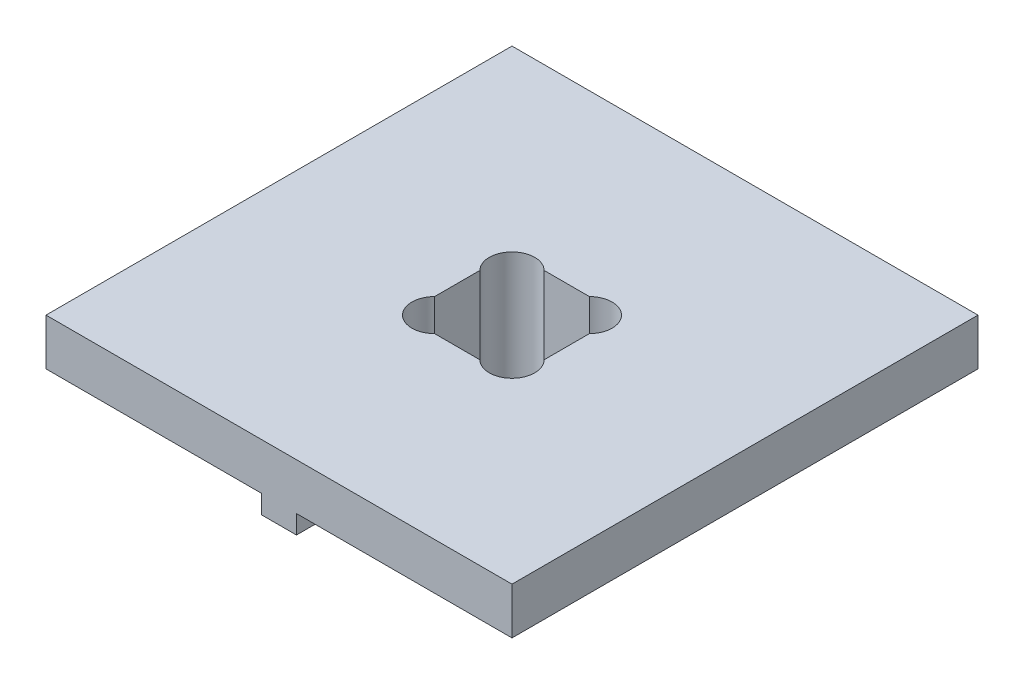
ISO-10303-21;
HEADER;
FILE_DESCRIPTION(('STEP AP214'),'2;1');
FILE_NAME('part.step','',(''),(''),'','','');
FILE_SCHEMA(('AUTOMOTIVE_DESIGN { 1 0 10303 214 1 1 1 1 }'));
ENDSEC;
DATA;
#1=APPLICATION_CONTEXT('core data for automotive mechanical design processes');
#2=APPLICATION_PROTOCOL_DEFINITION('international standard','automotive_design',2000,#1);
#3=PRODUCT_CONTEXT('',#1,'mechanical');
#4=PRODUCT('Part','Part','',(#3));
#5=PRODUCT_RELATED_PRODUCT_CATEGORY('part','',(#4));
#6=PRODUCT_DEFINITION_FORMATION('','',#4);
#7=PRODUCT_DEFINITION_CONTEXT('part definition',#1,'design');
#8=PRODUCT_DEFINITION('design','',#6,#7);
#9=PRODUCT_DEFINITION_SHAPE('','',#8);
#10=(LENGTH_UNIT() NAMED_UNIT(*) SI_UNIT(.MILLI.,.METRE.));
#11=(NAMED_UNIT(*) PLANE_ANGLE_UNIT() SI_UNIT($,.RADIAN.));
#12=(NAMED_UNIT(*) SI_UNIT($,.STERADIAN.) SOLID_ANGLE_UNIT());
#13=UNCERTAINTY_MEASURE_WITH_UNIT(LENGTH_MEASURE(1.E-05),#10,'distance_accuracy_value','');
#14=(GEOMETRIC_REPRESENTATION_CONTEXT(3) GLOBAL_UNCERTAINTY_ASSIGNED_CONTEXT((#13)) GLOBAL_UNIT_ASSIGNED_CONTEXT((#10,
#11,#12)) REPRESENTATION_CONTEXT('',''));
#15=CARTESIAN_POINT('',(0.,0.,0.));
#16=DIRECTION('',(0.,0.,1.));
#17=DIRECTION('',(1.,0.,0.));
#18=AXIS2_PLACEMENT_3D('',#15,#16,#17);
#19=CARTESIAN_POINT('',(-2.9845,10.16,-2.9845));
#20=DIRECTION('',(1.,0.,0.));
#21=DIRECTION('',(0.,0.,-1.));
#22=AXIS2_PLACEMENT_3D('',#19,#20,#21);
#23=PLANE('',#22);
#24=DIRECTION('',(0.,-1.,0.));
#25=VECTOR('',#24,1.);
#26=CARTESIAN_POINT('',(-2.9845,10.16,-1.2345));
#27=LINE('',#26,#25);
#28=CARTESIAN_POINT('',(-2.9845,-6.,-1.2345));
#29=VERTEX_POINT('',#28);
#30=CARTESIAN_POINT('',(-2.9845,2.54,-1.2345));
#31=VERTEX_POINT('',#30);
#32=EDGE_CURVE('E583',#29,#31,#27,.F.);
#33=ORIENTED_EDGE('',*,*,#32,.T.);
#34=DIRECTION('',(0.,0.,1.));
#35=VECTOR('',#34,1.);
#36=CARTESIAN_POINT('',(-2.9845,2.54,-2.9845));
#37=LINE('',#36,#35);
#38=CARTESIAN_POINT('',(-2.9845,2.54,1.2345));
#39=VERTEX_POINT('',#38);
#40=EDGE_CURVE('E468',#31,#39,#37,.T.);
#41=ORIENTED_EDGE('',*,*,#40,.T.);
#42=DIRECTION('',(0.,-1.,0.));
#43=VECTOR('',#42,1.);
#44=CARTESIAN_POINT('',(-2.9845,10.16,1.2345));
#45=LINE('',#44,#43);
#46=CARTESIAN_POINT('',(-2.9845,-6.,1.2345));
#47=VERTEX_POINT('',#46);
#48=EDGE_CURVE('E464',#47,#39,#45,.F.);
#49=ORIENTED_EDGE('',*,*,#48,.F.);
#50=DIRECTION('',(0.,0.,-1.));
#51=VECTOR('',#50,1.);
#52=CARTESIAN_POINT('',(-2.9845,-6.,2.9845));
#53=LINE('',#52,#51);
#54=EDGE_CURVE('E438',#47,#29,#53,.T.);
#55=ORIENTED_EDGE('',*,*,#54,.T.);
#56=EDGE_LOOP('',(#33,#41,#49,#55));
#57=FACE_BOUND('',#56,.T.);
#58=ADVANCED_FACE('F34',(#57),#23,.T.);
#59=CARTESIAN_POINT('',(-2.9845,10.16,-2.9845));
#60=DIRECTION('',(0.,0.,1.));
#61=DIRECTION('',(1.,0.,0.));
#62=AXIS2_PLACEMENT_3D('',#59,#60,#61);
#63=PLANE('',#62);
#64=DIRECTION('',(0.,-1.,0.));
#65=VECTOR('',#64,1.);
#66=CARTESIAN_POINT('',(1.2345,10.16,-2.9845));
#67=LINE('',#66,#65);
#68=CARTESIAN_POINT('',(1.2345,2.54,-2.9845));
#69=VERTEX_POINT('',#68);
#70=CARTESIAN_POINT('',(1.2345,-6.,-2.9845));
#71=VERTEX_POINT('',#70);
#72=EDGE_CURVE('E579',#69,#71,#67,.T.);
#73=ORIENTED_EDGE('',*,*,#72,.F.);
#74=DIRECTION('',(-1.,0.,0.));
#75=VECTOR('',#74,1.);
#76=CARTESIAN_POINT('',(-2.9845,2.54,-2.9845));
#77=LINE('',#76,#75);
#78=CARTESIAN_POINT('',(-1.2345,2.54,-2.9845));
#79=VERTEX_POINT('',#78);
#80=EDGE_CURVE('E227',#69,#79,#77,.T.);
#81=ORIENTED_EDGE('',*,*,#80,.T.);
#82=DIRECTION('',(0.,-1.,0.));
#83=VECTOR('',#82,1.);
#84=CARTESIAN_POINT('',(-1.2345,10.16,-2.9845));
#85=LINE('',#84,#83);
#86=CARTESIAN_POINT('',(-1.2345,-6.,-2.9845));
#87=VERTEX_POINT('',#86);
#88=EDGE_CURVE('E585',#79,#87,#85,.T.);
#89=ORIENTED_EDGE('',*,*,#88,.T.);
#90=DIRECTION('',(1.,0.,0.));
#91=VECTOR('',#90,1.);
#92=CARTESIAN_POINT('',(-2.9845,-6.,-2.9845));
#93=LINE('',#92,#91);
#94=EDGE_CURVE('E441',#87,#71,#93,.T.);
#95=ORIENTED_EDGE('',*,*,#94,.T.);
#96=EDGE_LOOP('',(#73,#81,#89,#95));
#97=FACE_BOUND('',#96,.T.);
#98=ADVANCED_FACE('F491',(#97),#63,.T.);
#99=CARTESIAN_POINT('',(-2.9845,10.16,2.9845));
#100=DIRECTION('',(0.,0.,-1.));
#101=DIRECTION('',(-1.,0.,0.));
#102=AXIS2_PLACEMENT_3D('',#99,#100,#101);
#103=PLANE('',#102);
#104=DIRECTION('',(0.,-1.,0.));
#105=VECTOR('',#104,1.);
#106=CARTESIAN_POINT('',(-1.2345,10.16,2.9845));
#107=LINE('',#106,#105);
#108=CARTESIAN_POINT('',(-1.2345,2.54,2.9845));
#109=VERTEX_POINT('',#108);
#110=CARTESIAN_POINT('',(-1.2345,-6.,2.9845));
#111=VERTEX_POINT('',#110);
#112=EDGE_CURVE('E452',#109,#111,#107,.T.);
#113=ORIENTED_EDGE('',*,*,#112,.F.);
#114=DIRECTION('',(1.,0.,0.));
#115=VECTOR('',#114,1.);
#116=CARTESIAN_POINT('',(-2.9845,2.54,2.9845));
#117=LINE('',#116,#115);
#118=CARTESIAN_POINT('',(1.2345,2.54,2.9845));
#119=VERTEX_POINT('',#118);
#120=EDGE_CURVE('E589',#109,#119,#117,.T.);
#121=ORIENTED_EDGE('',*,*,#120,.T.);
#122=DIRECTION('',(0.,-1.,0.));
#123=VECTOR('',#122,1.);
#124=CARTESIAN_POINT('',(1.2345,10.16,2.9845));
#125=LINE('',#124,#123);
#126=CARTESIAN_POINT('',(1.2345,-6.,2.9845));
#127=VERTEX_POINT('',#126);
#128=EDGE_CURVE('E454',#119,#127,#125,.T.);
#129=ORIENTED_EDGE('',*,*,#128,.T.);
#130=DIRECTION('',(-1.,0.,0.));
#131=VECTOR('',#130,1.);
#132=CARTESIAN_POINT('',(-2.9845,-6.,2.9845));
#133=LINE('',#132,#131);
#134=EDGE_CURVE('E301',#127,#111,#133,.T.);
#135=ORIENTED_EDGE('',*,*,#134,.T.);
#136=EDGE_LOOP('',(#113,#121,#129,#135));
#137=FACE_BOUND('',#136,.T.);
#138=ADVANCED_FACE('F450',(#137),#103,.T.);
#139=CARTESIAN_POINT('',(2.9845,10.16,-2.9845));
#140=DIRECTION('',(-1.,0.,0.));
#141=DIRECTION('',(0.,0.,1.));
#142=AXIS2_PLACEMENT_3D('',#139,#140,#141);
#143=PLANE('',#142);
#144=DIRECTION('',(0.,-1.,0.));
#145=VECTOR('',#144,1.);
#146=CARTESIAN_POINT('',(2.9845,10.16,1.2345));
#147=LINE('',#146,#145);
#148=CARTESIAN_POINT('',(2.9845,-6.,1.2345));
#149=VERTEX_POINT('',#148);
#150=CARTESIAN_POINT('',(2.9845,2.54,1.2345));
#151=VERTEX_POINT('',#150);
#152=EDGE_CURVE('E570',#149,#151,#147,.F.);
#153=ORIENTED_EDGE('',*,*,#152,.T.);
#154=DIRECTION('',(0.,0.,-1.));
#155=VECTOR('',#154,1.);
#156=CARTESIAN_POINT('',(2.9845,2.54,-2.9845));
#157=LINE('',#156,#155);
#158=CARTESIAN_POINT('',(2.9845,2.54,-1.2345));
#159=VERTEX_POINT('',#158);
#160=EDGE_CURVE('E572',#151,#159,#157,.T.);
#161=ORIENTED_EDGE('',*,*,#160,.T.);
#162=DIRECTION('',(0.,-1.,0.));
#163=VECTOR('',#162,1.);
#164=CARTESIAN_POINT('',(2.9845,10.16,-1.2345));
#165=LINE('',#164,#163);
#166=CARTESIAN_POINT('',(2.9845,-6.,-1.2345));
#167=VERTEX_POINT('',#166);
#168=EDGE_CURVE('E577',#167,#159,#165,.F.);
#169=ORIENTED_EDGE('',*,*,#168,.F.);
#170=DIRECTION('',(0.,0.,1.));
#171=VECTOR('',#170,1.);
#172=CARTESIAN_POINT('',(2.9845,-6.,2.9845));
#173=LINE('',#172,#171);
#174=EDGE_CURVE('E444',#167,#149,#173,.T.);
#175=ORIENTED_EDGE('',*,*,#174,.T.);
#176=EDGE_LOOP('',(#153,#161,#169,#175));
#177=FACE_BOUND('',#176,.T.);
#178=ADVANCED_FACE('F512',(#177),#143,.T.);
#179=CARTESIAN_POINT('',(-12.7,10.16,-12.7));
#180=DIRECTION('',(1.,0.,0.));
#181=DIRECTION('',(0.,0.,-1.));
#182=AXIS2_PLACEMENT_3D('',#179,#180,#181);
#183=PLANE('',#182);
#184=DIRECTION('',(0.,0.,-1.));
#185=VECTOR('',#184,1.);
#186=CARTESIAN_POINT('',(-12.7,2.54,-12.7));
#187=LINE('',#186,#185);
#188=CARTESIAN_POINT('',(-12.7,2.54,12.7));
#189=VERTEX_POINT('',#188);
#190=CARTESIAN_POINT('',(-12.7,2.54,-12.7));
#191=VERTEX_POINT('',#190);
#192=EDGE_CURVE('E217',#189,#191,#187,.T.);
#193=ORIENTED_EDGE('',*,*,#192,.T.);
#194=DIRECTION('',(0.,-1.,0.));
#195=VECTOR('',#194,1.);
#196=CARTESIAN_POINT('',(-12.7,10.16,-12.7));
#197=LINE('',#196,#195);
#198=CARTESIAN_POINT('',(-12.7,0.,-12.7));
#199=VERTEX_POINT('',#198);
#200=EDGE_CURVE('E380',#191,#199,#197,.T.);
#201=ORIENTED_EDGE('',*,*,#200,.T.);
#202=DIRECTION('',(0.,0.,1.));
#203=VECTOR('',#202,1.);
#204=CARTESIAN_POINT('',(-12.7,0.,-12.7));
#205=LINE('',#204,#203);
#206=CARTESIAN_POINT('',(-12.7,0.,12.7));
#207=VERTEX_POINT('',#206);
#208=EDGE_CURVE('E242',#199,#207,#205,.T.);
#209=ORIENTED_EDGE('',*,*,#208,.T.);
#210=DIRECTION('',(0.,-1.,0.));
#211=VECTOR('',#210,1.);
#212=CARTESIAN_POINT('',(-12.7,10.16,12.7));
#213=LINE('',#212,#211);
#214=EDGE_CURVE('E233',#189,#207,#213,.T.);
#215=ORIENTED_EDGE('',*,*,#214,.F.);
#216=EDGE_LOOP('',(#193,#201,#209,#215));
#217=FACE_BOUND('',#216,.T.);
#218=ADVANCED_FACE('F240',(#217),#183,.F.);
#219=CARTESIAN_POINT('',(-12.7,10.16,12.7));
#220=DIRECTION('',(0.,0.,-1.));
#221=DIRECTION('',(-1.,0.,0.));
#222=AXIS2_PLACEMENT_3D('',#219,#220,#221);
#223=PLANE('',#222);
#224=DIRECTION('',(-1.,0.,0.));
#225=VECTOR('',#224,1.);
#226=CARTESIAN_POINT('',(-12.7,2.54,12.7));
#227=LINE('',#226,#225);
#228=CARTESIAN_POINT('',(12.7,2.54,12.7));
#229=VERTEX_POINT('',#228);
#230=EDGE_CURVE('E220',#229,#189,#227,.T.);
#231=ORIENTED_EDGE('',*,*,#230,.T.);
#232=ORIENTED_EDGE('',*,*,#214,.T.);
#233=DIRECTION('',(1.,0.,0.));
#234=VECTOR('',#233,1.);
#235=CARTESIAN_POINT('',(-12.7,0.,12.7));
#236=LINE('',#235,#234);
#237=CARTESIAN_POINT('',(-0.9525,0.,12.7));
#238=VERTEX_POINT('',#237);
#239=EDGE_CURVE('E371',#207,#238,#236,.T.);
#240=ORIENTED_EDGE('',*,*,#239,.T.);
#241=DIRECTION('',(0.,1.,0.));
#242=VECTOR('',#241,1.);
#243=CARTESIAN_POINT('',(-0.9525,-1.016,12.7));
#244=LINE('',#243,#242);
#245=CARTESIAN_POINT('',(-0.9525,-1.016,12.7));
#246=VERTEX_POINT('',#245);
#247=EDGE_CURVE('E360',#246,#238,#244,.T.);
#248=ORIENTED_EDGE('',*,*,#247,.F.);
#249=DIRECTION('',(-1.,0.,0.));
#250=VECTOR('',#249,1.);
#251=CARTESIAN_POINT('',(0.9525,-1.016,12.7));
#252=LINE('',#251,#250);
#253=CARTESIAN_POINT('',(0.9525,-1.016,12.7));
#254=VERTEX_POINT('',#253);
#255=EDGE_CURVE('E354',#254,#246,#252,.T.);
#256=ORIENTED_EDGE('',*,*,#255,.F.);
#257=DIRECTION('',(0.,1.,0.));
#258=VECTOR('',#257,1.);
#259=CARTESIAN_POINT('',(0.9525,-1.016,12.7));
#260=LINE('',#259,#258);
#261=CARTESIAN_POINT('',(0.9525,0.,12.7));
#262=VERTEX_POINT('',#261);
#263=EDGE_CURVE('E366',#254,#262,#260,.T.);
#264=ORIENTED_EDGE('',*,*,#263,.T.);
#265=CARTESIAN_POINT('',(12.7,0.,12.7));
#266=VERTEX_POINT('',#265);
#267=EDGE_CURVE('E370',#262,#266,#236,.T.);
#268=ORIENTED_EDGE('',*,*,#267,.T.);
#269=DIRECTION('',(0.,-1.,0.));
#270=VECTOR('',#269,1.);
#271=CARTESIAN_POINT('',(12.7,10.16,12.7));
#272=LINE('',#271,#270);
#273=EDGE_CURVE('E236',#229,#266,#272,.T.);
#274=ORIENTED_EDGE('',*,*,#273,.F.);
#275=EDGE_LOOP('',(#231,#232,#240,#248,#256,#264,#268,#274));
#276=FACE_BOUND('',#275,.T.);
#277=ADVANCED_FACE('F231',(#276),#223,.F.);
#278=CARTESIAN_POINT('',(12.7,10.16,-12.7));
#279=DIRECTION('',(-1.,0.,0.));
#280=DIRECTION('',(0.,0.,1.));
#281=AXIS2_PLACEMENT_3D('',#278,#279,#280);
#282=PLANE('',#281);
#283=DIRECTION('',(0.,0.,1.));
#284=VECTOR('',#283,1.);
#285=CARTESIAN_POINT('',(12.7,2.54,12.7));
#286=LINE('',#285,#284);
#287=CARTESIAN_POINT('',(12.7,2.54,-12.7));
#288=VERTEX_POINT('',#287);
#289=EDGE_CURVE('E237',#288,#229,#286,.T.);
#290=ORIENTED_EDGE('',*,*,#289,.T.);
#291=ORIENTED_EDGE('',*,*,#273,.T.);
#292=DIRECTION('',(0.,0.,-1.));
#293=VECTOR('',#292,1.);
#294=CARTESIAN_POINT('',(12.7,0.,-12.7));
#295=LINE('',#294,#293);
#296=CARTESIAN_POINT('',(12.7,0.,-12.7));
#297=VERTEX_POINT('',#296);
#298=EDGE_CURVE('E373',#266,#297,#295,.T.);
#299=ORIENTED_EDGE('',*,*,#298,.T.);
#300=DIRECTION('',(0.,-1.,0.));
#301=VECTOR('',#300,1.);
#302=CARTESIAN_POINT('',(12.7,10.16,-12.7));
#303=LINE('',#302,#301);
#304=EDGE_CURVE('E247',#288,#297,#303,.T.);
#305=ORIENTED_EDGE('',*,*,#304,.F.);
#306=EDGE_LOOP('',(#290,#291,#299,#305));
#307=FACE_BOUND('',#306,.T.);
#308=ADVANCED_FACE('F388',(#307),#282,.F.);
#309=CARTESIAN_POINT('',(-12.7,10.16,-12.7));
#310=DIRECTION('',(0.,0.,1.));
#311=DIRECTION('',(1.,0.,0.));
#312=AXIS2_PLACEMENT_3D('',#309,#310,#311);
#313=PLANE('',#312);
#314=DIRECTION('',(1.,0.,0.));
#315=VECTOR('',#314,1.);
#316=CARTESIAN_POINT('',(12.7,2.54,-12.7));
#317=LINE('',#316,#315);
#318=EDGE_CURVE('E223',#191,#288,#317,.T.);
#319=ORIENTED_EDGE('',*,*,#318,.T.);
#320=ORIENTED_EDGE('',*,*,#304,.T.);
#321=DIRECTION('',(-1.,0.,0.));
#322=VECTOR('',#321,1.);
#323=CARTESIAN_POINT('',(-12.7,0.,-12.7));
#324=LINE('',#323,#322);
#325=CARTESIAN_POINT('',(0.9525,0.,-12.7));
#326=VERTEX_POINT('',#325);
#327=EDGE_CURVE('E377',#297,#326,#324,.T.);
#328=ORIENTED_EDGE('',*,*,#327,.T.);
#329=DIRECTION('',(0.,1.,0.));
#330=VECTOR('',#329,1.);
#331=CARTESIAN_POINT('',(0.9525,-1.016,-12.7));
#332=LINE('',#331,#330);
#333=CARTESIAN_POINT('',(0.9525,-1.016,-12.7));
#334=VERTEX_POINT('',#333);
#335=EDGE_CURVE('E342',#334,#326,#332,.T.);
#336=ORIENTED_EDGE('',*,*,#335,.F.);
#337=DIRECTION('',(-1.,0.,0.));
#338=VECTOR('',#337,1.);
#339=CARTESIAN_POINT('',(0.9525,-1.016,-12.7));
#340=LINE('',#339,#338);
#341=CARTESIAN_POINT('',(-0.9525,-1.016,-12.7));
#342=VERTEX_POINT('',#341);
#343=EDGE_CURVE('E339',#334,#342,#340,.T.);
#344=ORIENTED_EDGE('',*,*,#343,.T.);
#345=DIRECTION('',(0.,1.,0.));
#346=VECTOR('',#345,1.);
#347=CARTESIAN_POINT('',(-0.9525,-1.016,-12.7));
#348=LINE('',#347,#346);
#349=CARTESIAN_POINT('',(-0.9525,0.,-12.7));
#350=VERTEX_POINT('',#349);
#351=EDGE_CURVE('E348',#342,#350,#348,.T.);
#352=ORIENTED_EDGE('',*,*,#351,.T.);
#353=EDGE_CURVE('E376',#350,#199,#324,.T.);
#354=ORIENTED_EDGE('',*,*,#353,.T.);
#355=ORIENTED_EDGE('',*,*,#200,.F.);
#356=EDGE_LOOP('',(#319,#320,#328,#336,#344,#352,#354,#355));
#357=FACE_BOUND('',#356,.T.);
#358=ADVANCED_FACE('F383',(#357),#313,.F.);
#359=CARTESIAN_POINT('',(-2.1095,10.16,2.1095));
#360=DIRECTION('',(0.,-1.,0.));
#361=DIRECTION('',(0.,0.,-1.));
#362=AXIS2_PLACEMENT_3D('',#359,#360,#361);
#363=CYLINDRICAL_SURFACE('',#362,1.23743686707646);
#364=CARTESIAN_POINT('',(-2.1095,2.54,2.1095));
#365=DIRECTION('',(0.,1.,0.));
#366=DIRECTION('',(0.,0.,1.));
#367=AXIS2_PLACEMENT_3D('',#364,#365,#366);
#368=CIRCLE('',#367,1.23743686707646);
#369=EDGE_CURVE('E592',#109,#39,#368,.F.);
#370=ORIENTED_EDGE('',*,*,#369,.F.);
#371=ORIENTED_EDGE('',*,*,#112,.T.);
#372=CARTESIAN_POINT('',(-2.1095,-6.,2.1095));
#373=DIRECTION('',(0.,-1.,0.));
#374=DIRECTION('',(0.,0.,-1.));
#375=AXIS2_PLACEMENT_3D('',#372,#373,#374);
#376=CIRCLE('',#375,1.23743686707646);
#377=EDGE_CURVE('E243',#111,#47,#376,.T.);
#378=ORIENTED_EDGE('',*,*,#377,.T.);
#379=ORIENTED_EDGE('',*,*,#48,.T.);
#380=EDGE_LOOP('',(#370,#371,#378,#379));
#381=FACE_BOUND('',#380,.T.);
#382=ADVANCED_FACE('F463',(#381),#363,.F.);
#383=CARTESIAN_POINT('',(2.1095,10.16,2.1095));
#384=DIRECTION('',(0.,-1.,0.));
#385=DIRECTION('',(0.,0.,-1.));
#386=AXIS2_PLACEMENT_3D('',#383,#384,#385);
#387=CYLINDRICAL_SURFACE('',#386,1.23743686707646);
#388=ORIENTED_EDGE('',*,*,#128,.F.);
#389=CARTESIAN_POINT('',(2.1095,2.54,2.1095));
#390=DIRECTION('',(0.,1.,0.));
#391=DIRECTION('',(0.,0.,1.));
#392=AXIS2_PLACEMENT_3D('',#389,#390,#391);
#393=CIRCLE('',#392,1.23743686707646);
#394=EDGE_CURVE('E587',#119,#151,#393,.T.);
#395=ORIENTED_EDGE('',*,*,#394,.T.);
#396=ORIENTED_EDGE('',*,*,#152,.F.);
#397=CARTESIAN_POINT('',(2.1095,-6.,2.1095));
#398=DIRECTION('',(0.,-1.,0.));
#399=DIRECTION('',(0.,0.,-1.));
#400=AXIS2_PLACEMENT_3D('',#397,#398,#399);
#401=CIRCLE('',#400,1.23743686707646);
#402=EDGE_CURVE('E245',#127,#149,#401,.F.);
#403=ORIENTED_EDGE('',*,*,#402,.F.);
#404=EDGE_LOOP('',(#388,#395,#396,#403));
#405=FACE_BOUND('',#404,.T.);
#406=ADVANCED_FACE('F608',(#405),#387,.F.);
#407=CARTESIAN_POINT('',(2.1095,10.16,-2.1095));
#408=DIRECTION('',(0.,-1.,0.));
#409=DIRECTION('',(0.,0.,-1.));
#410=AXIS2_PLACEMENT_3D('',#407,#408,#409);
#411=CYLINDRICAL_SURFACE('',#410,1.23743686707646);
#412=CARTESIAN_POINT('',(2.1095,2.54,-2.1095));
#413=DIRECTION('',(0.,1.,0.));
#414=DIRECTION('',(0.,0.,1.));
#415=AXIS2_PLACEMENT_3D('',#412,#413,#414);
#416=CIRCLE('',#415,1.23743686707646);
#417=EDGE_CURVE('E594',#69,#159,#416,.F.);
#418=ORIENTED_EDGE('',*,*,#417,.F.);
#419=ORIENTED_EDGE('',*,*,#72,.T.);
#420=CARTESIAN_POINT('',(2.1095,-6.,-2.1095));
#421=DIRECTION('',(0.,-1.,0.));
#422=DIRECTION('',(0.,0.,-1.));
#423=AXIS2_PLACEMENT_3D('',#420,#421,#422);
#424=CIRCLE('',#423,1.23743686707646);
#425=EDGE_CURVE('E253',#71,#167,#424,.T.);
#426=ORIENTED_EDGE('',*,*,#425,.T.);
#427=ORIENTED_EDGE('',*,*,#168,.T.);
#428=EDGE_LOOP('',(#418,#419,#426,#427));
#429=FACE_BOUND('',#428,.T.);
#430=ADVANCED_FACE('F607',(#429),#411,.F.);
#431=CARTESIAN_POINT('',(-2.1095,10.16,-2.1095));
#432=DIRECTION('',(0.,-1.,0.));
#433=DIRECTION('',(0.,0.,-1.));
#434=AXIS2_PLACEMENT_3D('',#431,#432,#433);
#435=CYLINDRICAL_SURFACE('',#434,1.23743686707646);
#436=ORIENTED_EDGE('',*,*,#88,.F.);
#437=CARTESIAN_POINT('',(-2.1095,2.54,-2.1095));
#438=DIRECTION('',(0.,1.,0.));
#439=DIRECTION('',(0.,0.,1.));
#440=AXIS2_PLACEMENT_3D('',#437,#438,#439);
#441=CIRCLE('',#440,1.23743686707646);
#442=EDGE_CURVE('E258',#79,#31,#441,.T.);
#443=ORIENTED_EDGE('',*,*,#442,.T.);
#444=ORIENTED_EDGE('',*,*,#32,.F.);
#445=CARTESIAN_POINT('',(-2.1095,-6.,-2.1095));
#446=DIRECTION('',(0.,-1.,0.));
#447=DIRECTION('',(0.,0.,-1.));
#448=AXIS2_PLACEMENT_3D('',#445,#446,#447);
#449=CIRCLE('',#448,1.23743686707646);
#450=EDGE_CURVE('E255',#87,#29,#449,.F.);
#451=ORIENTED_EDGE('',*,*,#450,.F.);
#452=EDGE_LOOP('',(#436,#443,#444,#451));
#453=FACE_BOUND('',#452,.T.);
#454=ADVANCED_FACE('F556',(#453),#435,.F.);
#455=CARTESIAN_POINT('',(0.9525,-1.016,-2.9845));
#456=DIRECTION('',(1.,0.,0.));
#457=DIRECTION('',(0.,0.,-1.));
#458=AXIS2_PLACEMENT_3D('',#455,#456,#457);
#459=PLANE('',#458);
#460=DIRECTION('',(0.,0.,-1.));
#461=VECTOR('',#460,1.);
#462=CARTESIAN_POINT('',(0.9525,0.,-2.9845));
#463=LINE('',#462,#461);
#464=CARTESIAN_POINT('',(0.952500000000001,0.,-8.89));
#465=VERTEX_POINT('',#464);
#466=EDGE_CURVE('E325',#465,#326,#463,.T.);
#467=ORIENTED_EDGE('',*,*,#466,.F.);
#468=DIRECTION('',(0.,1.,0.));
#469=VECTOR('',#468,1.);
#470=CARTESIAN_POINT('',(0.952500000000001,-6.001,-8.89));
#471=LINE('',#470,#469);
#472=CARTESIAN_POINT('',(0.9525,-1.016,-8.89));
#473=VERTEX_POINT('',#472);
#474=EDGE_CURVE('E397',#473,#465,#471,.T.);
#475=ORIENTED_EDGE('',*,*,#474,.F.);
#476=DIRECTION('',(0.,0.,-1.));
#477=VECTOR('',#476,1.);
#478=CARTESIAN_POINT('',(0.9525,-1.016,-2.9845));
#479=LINE('',#478,#477);
#480=EDGE_CURVE('E333',#473,#334,#479,.T.);
#481=ORIENTED_EDGE('',*,*,#480,.T.);
#482=ORIENTED_EDGE('',*,*,#335,.T.);
#483=EDGE_LOOP('',(#467,#475,#481,#482));
#484=FACE_BOUND('',#483,.T.);
#485=ADVANCED_FACE('F396',(#484),#459,.T.);
#486=CARTESIAN_POINT('',(-0.9525,-1.016,-2.9845));
#487=DIRECTION('',(-1.,0.,0.));
#488=DIRECTION('',(0.,0.,1.));
#489=AXIS2_PLACEMENT_3D('',#486,#487,#488);
#490=PLANE('',#489);
#491=DIRECTION('',(0.,0.,1.));
#492=VECTOR('',#491,1.);
#493=CARTESIAN_POINT('',(-0.9525,-1.016,-2.9845));
#494=LINE('',#493,#492);
#495=CARTESIAN_POINT('',(-0.9525,-1.016,-8.89));
#496=VERTEX_POINT('',#495);
#497=EDGE_CURVE('E335',#342,#496,#494,.T.);
#498=ORIENTED_EDGE('',*,*,#497,.T.);
#499=DIRECTION('',(0.,1.,0.));
#500=VECTOR('',#499,1.);
#501=CARTESIAN_POINT('',(-0.9525,-6.001,-8.89));
#502=LINE('',#501,#500);
#503=CARTESIAN_POINT('',(-0.9525,0.,-8.89));
#504=VERTEX_POINT('',#503);
#505=EDGE_CURVE('E409',#496,#504,#502,.T.);
#506=ORIENTED_EDGE('',*,*,#505,.T.);
#507=DIRECTION('',(0.,0.,1.));
#508=VECTOR('',#507,1.);
#509=CARTESIAN_POINT('',(-0.9525,0.,-2.9845));
#510=LINE('',#509,#508);
#511=EDGE_CURVE('E336',#350,#504,#510,.T.);
#512=ORIENTED_EDGE('',*,*,#511,.F.);
#513=ORIENTED_EDGE('',*,*,#351,.F.);
#514=EDGE_LOOP('',(#498,#506,#512,#513));
#515=FACE_BOUND('',#514,.T.);
#516=ADVANCED_FACE('F407',(#515),#490,.T.);
#517=CARTESIAN_POINT('',(0.,-1.016,0.));
#518=DIRECTION('',(0.,-1.,0.));
#519=DIRECTION('',(0.,0.,1.));
#520=AXIS2_PLACEMENT_3D('',#517,#518,#519);
#521=PLANE('',#520);
#522=ORIENTED_EDGE('',*,*,#480,.F.);
#523=DIRECTION('',(1.,0.,0.));
#524=VECTOR('',#523,1.);
#525=CARTESIAN_POINT('',(0.952500000000001,-1.016,-8.89));
#526=LINE('',#525,#524);
#527=EDGE_CURVE('E404',#496,#473,#526,.T.);
#528=ORIENTED_EDGE('',*,*,#527,.F.);
#529=ORIENTED_EDGE('',*,*,#497,.F.);
#530=ORIENTED_EDGE('',*,*,#343,.F.);
#531=EDGE_LOOP('',(#522,#528,#529,#530));
#532=FACE_BOUND('',#531,.T.);
#533=ADVANCED_FACE('F402',(#532),#521,.T.);
#534=CARTESIAN_POINT('',(0.9525,-1.016,2.9845));
#535=DIRECTION('',(-1.,0.,0.));
#536=DIRECTION('',(0.,0.,1.));
#537=AXIS2_PLACEMENT_3D('',#534,#535,#536);
#538=PLANE('',#537);
#539=DIRECTION('',(0.,1.,0.));
#540=VECTOR('',#539,1.);
#541=CARTESIAN_POINT('',(0.9525,-6.001,8.89));
#542=LINE('',#541,#540);
#543=CARTESIAN_POINT('',(0.9525,-1.016,8.89));
#544=VERTEX_POINT('',#543);
#545=CARTESIAN_POINT('',(0.9525,0.,8.89));
#546=VERTEX_POINT('',#545);
#547=EDGE_CURVE('E429',#544,#546,#542,.T.);
#548=ORIENTED_EDGE('',*,*,#547,.T.);
#549=DIRECTION('',(0.,0.,1.));
#550=VECTOR('',#549,1.);
#551=CARTESIAN_POINT('',(0.9525,0.,2.9845));
#552=LINE('',#551,#550);
#553=EDGE_CURVE('E351',#546,#262,#552,.T.);
#554=ORIENTED_EDGE('',*,*,#553,.T.);
#555=ORIENTED_EDGE('',*,*,#263,.F.);
#556=DIRECTION('',(0.,0.,1.));
#557=VECTOR('',#556,1.);
#558=CARTESIAN_POINT('',(0.9525,-1.016,2.9845));
#559=LINE('',#558,#557);
#560=EDGE_CURVE('E352',#544,#254,#559,.T.);
#561=ORIENTED_EDGE('',*,*,#560,.F.);
#562=EDGE_LOOP('',(#548,#554,#555,#561));
#563=FACE_BOUND('',#562,.T.);
#564=ADVANCED_FACE('F427',(#563),#538,.F.);
#565=CARTESIAN_POINT('',(-0.9525,-1.016,2.9845));
#566=DIRECTION('',(1.,0.,0.));
#567=DIRECTION('',(0.,0.,-1.));
#568=AXIS2_PLACEMENT_3D('',#565,#566,#567);
#569=PLANE('',#568);
#570=DIRECTION('',(0.,1.,0.));
#571=VECTOR('',#570,1.);
#572=CARTESIAN_POINT('',(-0.9525,-6.001,8.89));
#573=LINE('',#572,#571);
#574=CARTESIAN_POINT('',(-0.9525,-1.016,8.89));
#575=VERTEX_POINT('',#574);
#576=CARTESIAN_POINT('',(-0.9525,0.,8.89));
#577=VERTEX_POINT('',#576);
#578=EDGE_CURVE('E418',#575,#577,#573,.T.);
#579=ORIENTED_EDGE('',*,*,#578,.F.);
#580=DIRECTION('',(0.,0.,-1.));
#581=VECTOR('',#580,1.);
#582=CARTESIAN_POINT('',(-0.9525,-1.016,2.9845));
#583=LINE('',#582,#581);
#584=EDGE_CURVE('E357',#246,#575,#583,.T.);
#585=ORIENTED_EDGE('',*,*,#584,.F.);
#586=ORIENTED_EDGE('',*,*,#247,.T.);
#587=DIRECTION('',(0.,0.,-1.));
#588=VECTOR('',#587,1.);
#589=CARTESIAN_POINT('',(-0.9525,0.,2.9845));
#590=LINE('',#589,#588);
#591=EDGE_CURVE('E355',#238,#577,#590,.T.);
#592=ORIENTED_EDGE('',*,*,#591,.T.);
#593=EDGE_LOOP('',(#579,#585,#586,#592));
#594=FACE_BOUND('',#593,.T.);
#595=ADVANCED_FACE('F417',(#594),#569,.F.);
#596=CARTESIAN_POINT('',(0.,-1.016,0.));
#597=DIRECTION('',(0.,-1.,0.));
#598=DIRECTION('',(0.,0.,-1.));
#599=AXIS2_PLACEMENT_3D('',#596,#597,#598);
#600=PLANE('',#599);
#601=ORIENTED_EDGE('',*,*,#584,.T.);
#602=DIRECTION('',(-1.,0.,0.));
#603=VECTOR('',#602,1.);
#604=CARTESIAN_POINT('',(0.9525,-1.016,8.89));
#605=LINE('',#604,#603);
#606=EDGE_CURVE('E422',#544,#575,#605,.T.);
#607=ORIENTED_EDGE('',*,*,#606,.F.);
#608=ORIENTED_EDGE('',*,*,#560,.T.);
#609=ORIENTED_EDGE('',*,*,#255,.T.);
#610=EDGE_LOOP('',(#601,#607,#608,#609));
#611=FACE_BOUND('',#610,.T.);
#612=ADVANCED_FACE('F421',(#611),#600,.T.);
#613=CARTESIAN_POINT('',(0.,0.,0.));
#614=DIRECTION('',(0.,1.,0.));
#615=DIRECTION('',(0.,0.,1.));
#616=AXIS2_PLACEMENT_3D('',#613,#614,#615);
#617=PLANE('',#616);
#618=DIRECTION('',(1.,0.,0.));
#619=VECTOR('',#618,1.);
#620=CARTESIAN_POINT('',(0.952500000000001,0.,-8.89));
#621=LINE('',#620,#619);
#622=EDGE_CURVE('E393',#504,#465,#621,.T.);
#623=ORIENTED_EDGE('',*,*,#622,.T.);
#624=ORIENTED_EDGE('',*,*,#466,.T.);
#625=ORIENTED_EDGE('',*,*,#327,.F.);
#626=ORIENTED_EDGE('',*,*,#298,.F.);
#627=ORIENTED_EDGE('',*,*,#267,.F.);
#628=ORIENTED_EDGE('',*,*,#553,.F.);
#629=DIRECTION('',(-1.,0.,0.));
#630=VECTOR('',#629,1.);
#631=CARTESIAN_POINT('',(0.9525,0.,8.89));
#632=LINE('',#631,#630);
#633=EDGE_CURVE('E430',#546,#577,#632,.T.);
#634=ORIENTED_EDGE('',*,*,#633,.T.);
#635=ORIENTED_EDGE('',*,*,#591,.F.);
#636=ORIENTED_EDGE('',*,*,#239,.F.);
#637=ORIENTED_EDGE('',*,*,#208,.F.);
#638=ORIENTED_EDGE('',*,*,#353,.F.);
#639=ORIENTED_EDGE('',*,*,#511,.T.);
#640=EDGE_LOOP('',(#623,#624,#625,#626,#627,#628,#634,#635,#636,#637,#638,#639));
#641=FACE_BOUND('',#640,.T.);
#642=DIRECTION('',(1.,0.,0.));
#643=VECTOR('',#642,1.);
#644=CARTESIAN_POINT('',(-4.7244,0.,-4.7244));
#645=LINE('',#644,#643);
#646=CARTESIAN_POINT('',(-2.9464,0.,-4.7244));
#647=VERTEX_POINT('',#646);
#648=CARTESIAN_POINT('',(2.9464,0.,-4.7244));
#649=VERTEX_POINT('',#648);
#650=EDGE_CURVE('E295',#647,#649,#645,.T.);
#651=ORIENTED_EDGE('',*,*,#650,.F.);
#652=CARTESIAN_POINT('',(-2.9464,0.,-2.9464));
#653=DIRECTION('',(0.,1.,0.));
#654=DIRECTION('',(0.,0.,1.));
#655=AXIS2_PLACEMENT_3D('',#652,#653,#654);
#656=CIRCLE('',#655,1.778);
#657=CARTESIAN_POINT('',(-4.7244,0.,-2.9464));
#658=VERTEX_POINT('',#657);
#659=EDGE_CURVE('E42',#647,#658,#656,.T.);
#660=ORIENTED_EDGE('',*,*,#659,.T.);
#661=DIRECTION('',(0.,0.,-1.));
#662=VECTOR('',#661,1.);
#663=CARTESIAN_POINT('',(-4.7244,0.,4.7244));
#664=LINE('',#663,#662);
#665=CARTESIAN_POINT('',(-4.7244,0.,2.9464));
#666=VERTEX_POINT('',#665);
#667=EDGE_CURVE('E294',#666,#658,#664,.T.);
#668=ORIENTED_EDGE('',*,*,#667,.F.);
#669=CARTESIAN_POINT('',(-2.9464,0.,2.9464));
#670=DIRECTION('',(0.,1.,0.));
#671=DIRECTION('',(0.,0.,1.));
#672=AXIS2_PLACEMENT_3D('',#669,#670,#671);
#673=CIRCLE('',#672,1.778);
#674=CARTESIAN_POINT('',(-2.9464,0.,4.7244));
#675=VERTEX_POINT('',#674);
#676=EDGE_CURVE('E288',#666,#675,#673,.T.);
#677=ORIENTED_EDGE('',*,*,#676,.T.);
#678=DIRECTION('',(-1.,0.,0.));
#679=VECTOR('',#678,1.);
#680=CARTESIAN_POINT('',(-4.7244,0.,4.7244));
#681=LINE('',#680,#679);
#682=CARTESIAN_POINT('',(2.9464,0.,4.7244));
#683=VERTEX_POINT('',#682);
#684=EDGE_CURVE('E321',#683,#675,#681,.T.);
#685=ORIENTED_EDGE('',*,*,#684,.F.);
#686=CARTESIAN_POINT('',(2.9464,0.,2.9464));
#687=DIRECTION('',(0.,1.,0.));
#688=DIRECTION('',(0.,0.,1.));
#689=AXIS2_PLACEMENT_3D('',#686,#687,#688);
#690=CIRCLE('',#689,1.778);
#691=CARTESIAN_POINT('',(4.7244,0.,2.9464));
#692=VERTEX_POINT('',#691);
#693=EDGE_CURVE('E290',#683,#692,#690,.T.);
#694=ORIENTED_EDGE('',*,*,#693,.T.);
#695=DIRECTION('',(0.,0.,1.));
#696=VECTOR('',#695,1.);
#697=CARTESIAN_POINT('',(4.7244,0.,4.7244));
#698=LINE('',#697,#696);
#699=CARTESIAN_POINT('',(4.7244,0.,-2.9464));
#700=VERTEX_POINT('',#699);
#701=EDGE_CURVE('E328',#700,#692,#698,.T.);
#702=ORIENTED_EDGE('',*,*,#701,.F.);
#703=CARTESIAN_POINT('',(2.9464,0.,-2.9464));
#704=DIRECTION('',(0.,1.,0.));
#705=DIRECTION('',(0.,0.,1.));
#706=AXIS2_PLACEMENT_3D('',#703,#704,#705);
#707=CIRCLE('',#706,1.778);
#708=EDGE_CURVE('E12',#700,#649,#707,.T.);
#709=ORIENTED_EDGE('',*,*,#708,.T.);
#710=EDGE_LOOP('',(#651,#660,#668,#677,#685,#694,#702,#709));
#711=FACE_BOUND('',#710,.T.);
#712=ADVANCED_FACE('F293',(#641,#711),#617,.F.);
#713=CARTESIAN_POINT('',(-4.7244,-6.,4.7244));
#714=DIRECTION('',(0.,0.,-1.));
#715=DIRECTION('',(-1.,0.,0.));
#716=AXIS2_PLACEMENT_3D('',#713,#714,#715);
#717=PLANE('',#716);
#718=ORIENTED_EDGE('',*,*,#684,.T.);
#719=DIRECTION('',(0.,1.,0.));
#720=VECTOR('',#719,1.);
#721=CARTESIAN_POINT('',(-2.9464,-6.,4.7244));
#722=LINE('',#721,#720);
#723=CARTESIAN_POINT('',(-2.9464,-6.,4.7244));
#724=VERTEX_POINT('',#723);
#725=EDGE_CURVE('E269',#675,#724,#722,.F.);
#726=ORIENTED_EDGE('',*,*,#725,.T.);
#727=DIRECTION('',(-1.,0.,0.));
#728=VECTOR('',#727,1.);
#729=CARTESIAN_POINT('',(-4.7244,-6.,4.7244));
#730=LINE('',#729,#728);
#731=CARTESIAN_POINT('',(2.9464,-6.,4.7244));
#732=VERTEX_POINT('',#731);
#733=EDGE_CURVE('E319',#732,#724,#730,.T.);
#734=ORIENTED_EDGE('',*,*,#733,.F.);
#735=DIRECTION('',(0.,1.,0.));
#736=VECTOR('',#735,1.);
#737=CARTESIAN_POINT('',(2.9464,-6.,4.7244));
#738=LINE('',#737,#736);
#739=EDGE_CURVE('E266',#732,#683,#738,.T.);
#740=ORIENTED_EDGE('',*,*,#739,.T.);
#741=EDGE_LOOP('',(#718,#726,#734,#740));
#742=FACE_BOUND('',#741,.T.);
#743=ADVANCED_FACE('F503',(#742),#717,.F.);
#744=CARTESIAN_POINT('',(0.,-6.,0.));
#745=DIRECTION('',(0.,-1.,0.));
#746=DIRECTION('',(0.,0.,-1.));
#747=AXIS2_PLACEMENT_3D('',#744,#745,#746);
#748=PLANE('',#747);
#749=ORIENTED_EDGE('',*,*,#94,.F.);
#750=ORIENTED_EDGE('',*,*,#450,.T.);
#751=ORIENTED_EDGE('',*,*,#54,.F.);
#752=ORIENTED_EDGE('',*,*,#377,.F.);
#753=ORIENTED_EDGE('',*,*,#134,.F.);
#754=ORIENTED_EDGE('',*,*,#402,.T.);
#755=ORIENTED_EDGE('',*,*,#174,.F.);
#756=ORIENTED_EDGE('',*,*,#425,.F.);
#757=EDGE_LOOP('',(#749,#750,#751,#752,#753,#754,#755,#756));
#758=FACE_BOUND('',#757,.T.);
#759=ORIENTED_EDGE('',*,*,#733,.T.);
#760=CARTESIAN_POINT('',(-2.9464,-6.,2.9464));
#761=DIRECTION('',(0.,-1.,0.));
#762=DIRECTION('',(0.,0.,-1.));
#763=AXIS2_PLACEMENT_3D('',#760,#761,#762);
#764=CIRCLE('',#763,1.778);
#765=CARTESIAN_POINT('',(-4.7244,-6.,2.9464));
#766=VERTEX_POINT('',#765);
#767=EDGE_CURVE('E277',#724,#766,#764,.T.);
#768=ORIENTED_EDGE('',*,*,#767,.T.);
#769=DIRECTION('',(0.,0.,-1.));
#770=VECTOR('',#769,1.);
#771=CARTESIAN_POINT('',(-4.7244,-6.,4.7244));
#772=LINE('',#771,#770);
#773=CARTESIAN_POINT('',(-4.7244,-6.,-2.9464));
#774=VERTEX_POINT('',#773);
#775=EDGE_CURVE('E312',#766,#774,#772,.T.);
#776=ORIENTED_EDGE('',*,*,#775,.T.);
#777=CARTESIAN_POINT('',(-2.9464,-6.,-2.9464));
#778=DIRECTION('',(0.,-1.,0.));
#779=DIRECTION('',(0.,0.,-1.));
#780=AXIS2_PLACEMENT_3D('',#777,#778,#779);
#781=CIRCLE('',#780,1.778);
#782=CARTESIAN_POINT('',(-2.9464,-6.,-4.7244));
#783=VERTEX_POINT('',#782);
#784=EDGE_CURVE('E273',#774,#783,#781,.T.);
#785=ORIENTED_EDGE('',*,*,#784,.T.);
#786=DIRECTION('',(1.,0.,0.));
#787=VECTOR('',#786,1.);
#788=CARTESIAN_POINT('',(-4.7244,-6.,-4.7244));
#789=LINE('',#788,#787);
#790=CARTESIAN_POINT('',(2.9464,-6.,-4.7244));
#791=VERTEX_POINT('',#790);
#792=EDGE_CURVE('E310',#783,#791,#789,.T.);
#793=ORIENTED_EDGE('',*,*,#792,.T.);
#794=CARTESIAN_POINT('',(2.9464,-6.,-2.9464));
#795=DIRECTION('',(0.,-1.,0.));
#796=DIRECTION('',(0.,0.,-1.));
#797=AXIS2_PLACEMENT_3D('',#794,#795,#796);
#798=CIRCLE('',#797,1.778);
#799=CARTESIAN_POINT('',(4.7244,-6.,-2.9464));
#800=VERTEX_POINT('',#799);
#801=EDGE_CURVE('E271',#791,#800,#798,.T.);
#802=ORIENTED_EDGE('',*,*,#801,.T.);
#803=DIRECTION('',(0.,0.,1.));
#804=VECTOR('',#803,1.);
#805=CARTESIAN_POINT('',(4.7244,-6.,4.7244));
#806=LINE('',#805,#804);
#807=CARTESIAN_POINT('',(4.7244,-6.,2.9464));
#808=VERTEX_POINT('',#807);
#809=EDGE_CURVE('E316',#800,#808,#806,.T.);
#810=ORIENTED_EDGE('',*,*,#809,.T.);
#811=CARTESIAN_POINT('',(2.9464,-6.,2.9464));
#812=DIRECTION('',(0.,-1.,0.));
#813=DIRECTION('',(0.,0.,-1.));
#814=AXIS2_PLACEMENT_3D('',#811,#812,#813);
#815=CIRCLE('',#814,1.778);
#816=EDGE_CURVE('E275',#808,#732,#815,.T.);
#817=ORIENTED_EDGE('',*,*,#816,.T.);
#818=EDGE_LOOP('',(#759,#768,#776,#785,#793,#802,#810,#817));
#819=FACE_BOUND('',#818,.T.);
#820=ADVANCED_FACE('F309',(#758,#819),#748,.T.);
#821=CARTESIAN_POINT('',(-4.7244,-6.,4.7244));
#822=DIRECTION('',(1.,0.,0.));
#823=DIRECTION('',(0.,0.,-1.));
#824=AXIS2_PLACEMENT_3D('',#821,#822,#823);
#825=PLANE('',#824);
#826=ORIENTED_EDGE('',*,*,#775,.F.);
#827=DIRECTION('',(0.,1.,0.));
#828=VECTOR('',#827,1.);
#829=CARTESIAN_POINT('',(-4.7244,-6.,2.9464));
#830=LINE('',#829,#828);
#831=EDGE_CURVE('E263',#766,#666,#830,.T.);
#832=ORIENTED_EDGE('',*,*,#831,.T.);
#833=ORIENTED_EDGE('',*,*,#667,.T.);
#834=DIRECTION('',(0.,1.,0.));
#835=VECTOR('',#834,1.);
#836=CARTESIAN_POINT('',(-4.7244,-6.,-2.9464));
#837=LINE('',#836,#835);
#838=EDGE_CURVE('E261',#658,#774,#837,.F.);
#839=ORIENTED_EDGE('',*,*,#838,.T.);
#840=EDGE_LOOP('',(#826,#832,#833,#839));
#841=FACE_BOUND('',#840,.T.);
#842=ADVANCED_FACE('F298',(#841),#825,.F.);
#843=CARTESIAN_POINT('',(-4.7244,-6.,-4.7244));
#844=DIRECTION('',(0.,0.,1.));
#845=DIRECTION('',(1.,0.,0.));
#846=AXIS2_PLACEMENT_3D('',#843,#844,#845);
#847=PLANE('',#846);
#848=ORIENTED_EDGE('',*,*,#792,.F.);
#849=DIRECTION('',(0.,1.,0.));
#850=VECTOR('',#849,1.);
#851=CARTESIAN_POINT('',(-2.9464,-6.,-4.7244));
#852=LINE('',#851,#850);
#853=EDGE_CURVE('E286',#783,#647,#852,.T.);
#854=ORIENTED_EDGE('',*,*,#853,.T.);
#855=ORIENTED_EDGE('',*,*,#650,.T.);
#856=DIRECTION('',(0.,1.,0.));
#857=VECTOR('',#856,1.);
#858=CARTESIAN_POINT('',(2.9464,-6.,-4.7244));
#859=LINE('',#858,#857);
#860=EDGE_CURVE('E284',#649,#791,#859,.F.);
#861=ORIENTED_EDGE('',*,*,#860,.T.);
#862=EDGE_LOOP('',(#848,#854,#855,#861));
#863=FACE_BOUND('',#862,.T.);
#864=ADVANCED_FACE('F314',(#863),#847,.F.);
#865=CARTESIAN_POINT('',(4.7244,-6.,4.7244));
#866=DIRECTION('',(-1.,0.,0.));
#867=DIRECTION('',(0.,0.,1.));
#868=AXIS2_PLACEMENT_3D('',#865,#866,#867);
#869=PLANE('',#868);
#870=ORIENTED_EDGE('',*,*,#701,.T.);
#871=DIRECTION('',(0.,1.,0.));
#872=VECTOR('',#871,1.);
#873=CARTESIAN_POINT('',(4.7244,-6.,2.9464));
#874=LINE('',#873,#872);
#875=EDGE_CURVE('E282',#692,#808,#874,.F.);
#876=ORIENTED_EDGE('',*,*,#875,.T.);
#877=ORIENTED_EDGE('',*,*,#809,.F.);
#878=DIRECTION('',(0.,1.,0.));
#879=VECTOR('',#878,1.);
#880=CARTESIAN_POINT('',(4.7244,-6.,-2.9464));
#881=LINE('',#880,#879);
#882=EDGE_CURVE('E279',#800,#700,#881,.T.);
#883=ORIENTED_EDGE('',*,*,#882,.T.);
#884=EDGE_LOOP('',(#870,#876,#877,#883));
#885=FACE_BOUND('',#884,.T.);
#886=ADVANCED_FACE('F487',(#885),#869,.F.);
#887=CARTESIAN_POINT('',(0.9525,-6.001,8.89));
#888=DIRECTION('',(0.,0.,-1.));
#889=DIRECTION('',(-1.,0.,0.));
#890=AXIS2_PLACEMENT_3D('',#887,#888,#889);
#891=PLANE('',#890);
#892=ORIENTED_EDGE('',*,*,#606,.T.);
#893=ORIENTED_EDGE('',*,*,#578,.T.);
#894=ORIENTED_EDGE('',*,*,#633,.F.);
#895=ORIENTED_EDGE('',*,*,#547,.F.);
#896=EDGE_LOOP('',(#892,#893,#894,#895));
#897=FACE_BOUND('',#896,.T.);
#898=ADVANCED_FACE('F478',(#897),#891,.T.);
#899=CARTESIAN_POINT('',(0.952500000000001,-6.001,-8.89));
#900=DIRECTION('',(0.,0.,1.));
#901=DIRECTION('',(1.,0.,0.));
#902=AXIS2_PLACEMENT_3D('',#899,#900,#901);
#903=PLANE('',#902);
#904=ORIENTED_EDGE('',*,*,#527,.T.);
#905=ORIENTED_EDGE('',*,*,#474,.T.);
#906=ORIENTED_EDGE('',*,*,#622,.F.);
#907=ORIENTED_EDGE('',*,*,#505,.F.);
#908=EDGE_LOOP('',(#904,#905,#906,#907));
#909=FACE_BOUND('',#908,.T.);
#910=ADVANCED_FACE('F476',(#909),#903,.T.);
#911=CARTESIAN_POINT('',(0.,2.54,0.));
#912=DIRECTION('',(0.,1.,0.));
#913=DIRECTION('',(0.,0.,1.));
#914=AXIS2_PLACEMENT_3D('',#911,#912,#913);
#915=PLANE('',#914);
#916=ORIENTED_EDGE('',*,*,#120,.F.);
#917=ORIENTED_EDGE('',*,*,#369,.T.);
#918=ORIENTED_EDGE('',*,*,#40,.F.);
#919=ORIENTED_EDGE('',*,*,#442,.F.);
#920=ORIENTED_EDGE('',*,*,#80,.F.);
#921=ORIENTED_EDGE('',*,*,#417,.T.);
#922=ORIENTED_EDGE('',*,*,#160,.F.);
#923=ORIENTED_EDGE('',*,*,#394,.F.);
#924=EDGE_LOOP('',(#916,#917,#918,#919,#920,#921,#922,#923));
#925=FACE_BOUND('',#924,.T.);
#926=ORIENTED_EDGE('',*,*,#318,.F.);
#927=ORIENTED_EDGE('',*,*,#192,.F.);
#928=ORIENTED_EDGE('',*,*,#230,.F.);
#929=ORIENTED_EDGE('',*,*,#289,.F.);
#930=EDGE_LOOP('',(#926,#927,#928,#929));
#931=FACE_BOUND('',#930,.T.);
#932=ADVANCED_FACE('F219',(#925,#931),#915,.T.);
#933=CARTESIAN_POINT('',(-2.9464,-6.,2.9464));
#934=DIRECTION('',(0.,1.,0.));
#935=DIRECTION('',(0.,0.,1.));
#936=AXIS2_PLACEMENT_3D('',#933,#934,#935);
#937=CYLINDRICAL_SURFACE('',#936,1.778);
#938=ORIENTED_EDGE('',*,*,#767,.F.);
#939=ORIENTED_EDGE('',*,*,#725,.F.);
#940=ORIENTED_EDGE('',*,*,#676,.F.);
#941=ORIENTED_EDGE('',*,*,#831,.F.);
#942=EDGE_LOOP('',(#938,#939,#940,#941));
#943=FACE_BOUND('',#942,.T.);
#944=ADVANCED_FACE('F484',(#943),#937,.T.);
#945=CARTESIAN_POINT('',(2.9464,-6.,2.9464));
#946=DIRECTION('',(0.,1.,0.));
#947=DIRECTION('',(0.,0.,1.));
#948=AXIS2_PLACEMENT_3D('',#945,#946,#947);
#949=CYLINDRICAL_SURFACE('',#948,1.778);
#950=ORIENTED_EDGE('',*,*,#816,.F.);
#951=ORIENTED_EDGE('',*,*,#875,.F.);
#952=ORIENTED_EDGE('',*,*,#693,.F.);
#953=ORIENTED_EDGE('',*,*,#739,.F.);
#954=EDGE_LOOP('',(#950,#951,#952,#953));
#955=FACE_BOUND('',#954,.T.);
#956=ADVANCED_FACE('F515',(#955),#949,.T.);
#957=CARTESIAN_POINT('',(-2.9464,-6.,-2.9464));
#958=DIRECTION('',(0.,1.,0.));
#959=DIRECTION('',(0.,0.,1.));
#960=AXIS2_PLACEMENT_3D('',#957,#958,#959);
#961=CYLINDRICAL_SURFACE('',#960,1.778);
#962=ORIENTED_EDGE('',*,*,#784,.F.);
#963=ORIENTED_EDGE('',*,*,#838,.F.);
#964=ORIENTED_EDGE('',*,*,#659,.F.);
#965=ORIENTED_EDGE('',*,*,#853,.F.);
#966=EDGE_LOOP('',(#962,#963,#964,#965));
#967=FACE_BOUND('',#966,.T.);
#968=ADVANCED_FACE('F304',(#967),#961,.T.);
#969=CARTESIAN_POINT('',(2.9464,-6.,-2.9464));
#970=DIRECTION('',(0.,1.,0.));
#971=DIRECTION('',(0.,0.,1.));
#972=AXIS2_PLACEMENT_3D('',#969,#970,#971);
#973=CYLINDRICAL_SURFACE('',#972,1.778);
#974=ORIENTED_EDGE('',*,*,#801,.F.);
#975=ORIENTED_EDGE('',*,*,#860,.F.);
#976=ORIENTED_EDGE('',*,*,#708,.F.);
#977=ORIENTED_EDGE('',*,*,#882,.F.);
#978=EDGE_LOOP('',(#974,#975,#976,#977));
#979=FACE_BOUND('',#978,.T.);
#980=ADVANCED_FACE('F36',(#979),#973,.T.);
#981=CLOSED_SHELL('',(#58,#98,#138,#178,#218,#277,#308,#358,#382,#406,#430,#454,#485,#516,#533,
#564,#595,#612,#712,#743,#820,#842,#864,#886,#898,#910,#932,#944,#956,#968,#980));
#982=MANIFOLD_SOLID_BREP('B2',#981);
#983=ADVANCED_BREP_SHAPE_REPRESENTATION('',(#18,#982),#14);
#984=SHAPE_DEFINITION_REPRESENTATION(#9,#983);
ENDSEC;
END-ISO-10303-21;
